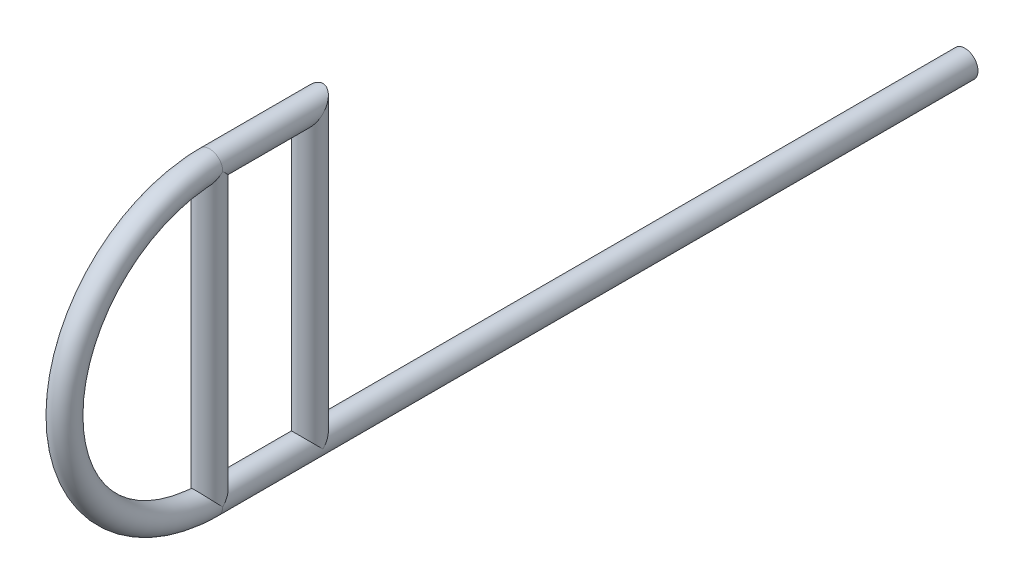
ISO-10303-21;
HEADER;
FILE_DESCRIPTION(('STEP AP214'),'2;1');
FILE_NAME('part.step','',(''),(''),'','','');
FILE_SCHEMA(('AUTOMOTIVE_DESIGN { 1 0 10303 214 1 1 1 1 }'));
ENDSEC;
DATA;
#1=APPLICATION_CONTEXT('core data for automotive mechanical design processes');
#2=APPLICATION_PROTOCOL_DEFINITION('international standard','automotive_design',2000,#1);
#3=PRODUCT_CONTEXT('',#1,'mechanical');
#4=PRODUCT('Part','Part','',(#3));
#5=PRODUCT_RELATED_PRODUCT_CATEGORY('part','',(#4));
#6=PRODUCT_DEFINITION_FORMATION('','',#4);
#7=PRODUCT_DEFINITION_CONTEXT('part definition',#1,'design');
#8=PRODUCT_DEFINITION('design','',#6,#7);
#9=PRODUCT_DEFINITION_SHAPE('','',#8);
#10=(LENGTH_UNIT() NAMED_UNIT(*) SI_UNIT(.MILLI.,.METRE.));
#11=(NAMED_UNIT(*) PLANE_ANGLE_UNIT() SI_UNIT($,.RADIAN.));
#12=(NAMED_UNIT(*) SI_UNIT($,.STERADIAN.) SOLID_ANGLE_UNIT());
#13=UNCERTAINTY_MEASURE_WITH_UNIT(LENGTH_MEASURE(1.E-05),#10,'distance_accuracy_value','');
#14=(GEOMETRIC_REPRESENTATION_CONTEXT(3) GLOBAL_UNCERTAINTY_ASSIGNED_CONTEXT((#13)) GLOBAL_UNIT_ASSIGNED_CONTEXT((#10,
#11,#12)) REPRESENTATION_CONTEXT('',''));
#15=CARTESIAN_POINT('',(0.,0.,0.));
#16=DIRECTION('',(0.,0.,1.));
#17=DIRECTION('',(1.,0.,0.));
#18=AXIS2_PLACEMENT_3D('',#15,#16,#17);
#19=CARTESIAN_POINT('',(0.,500.,2600.));
#20=DIRECTION('',(1.,0.,0.));
#21=DIRECTION('',(0.,0.,-1.));
#22=AXIS2_PLACEMENT_3D('',#19,#20,#21);
#23=TOROIDAL_SURFACE('',#22,500.,45.);
#24=CARTESIAN_POINT('',(0.,0.,2600.));
#25=DIRECTION('',(0.,0.,-1.));
#26=DIRECTION('',(1.,0.,0.));
#27=AXIS2_PLACEMENT_3D('',#24,#25,#26);
#28=CIRCLE('',#27,45.);
#29=CARTESIAN_POINT('',(45.,0.,2600.));
#30=VERTEX_POINT('',#29);
#31=CARTESIAN_POINT('',(-45.,0.,2600.));
#32=VERTEX_POINT('',#31);
#33=EDGE_CURVE('E96',#30,#32,#28,.T.);
#34=ORIENTED_EDGE('',*,*,#33,.F.);
#35=CARTESIAN_POINT('',(45.,0.,2600.));
#36=CARTESIAN_POINT('',(44.9999999986932,0.00999996302583945,2600.00999996408));
#37=CARTESIAN_POINT('',(44.9999966653993,0.020000113522494,2600.01999981456));
#38=CARTESIAN_POINT('',(44.99881184836,1.79770313038391,2601.79759597686));
#39=CARTESIAN_POINT('',(44.893529322003,3.57121797631516,2603.56159714986));
#40=CARTESIAN_POINT('',(44.580833591385,6.22910752234717,2606.19109415175));
#41=CARTESIAN_POINT('',(44.4506943152232,7.11515092709802,2607.06530950447));
#42=CARTESIAN_POINT('',(44.1386637373208,8.88501733441618,2608.80685606489));
#43=CARTESIAN_POINT('',(43.9567751953007,9.76884045285351,2609.67418763716));
#44=CARTESIAN_POINT('',(43.5405102554132,11.5347274361979,2611.40245925246));
#45=CARTESIAN_POINT('',(43.3060049168106,12.4167815154403,2612.26337813296));
#46=CARTESIAN_POINT('',(42.7843193220845,14.1752325468286,2613.97506832337));
#47=CARTESIAN_POINT('',(42.4971372671155,15.0516293047256,2614.82583928567));
#48=CARTESIAN_POINT('',(41.8696152121863,16.7964043792479,2616.51504577532));
#49=CARTESIAN_POINT('',(41.5293014252306,17.6647864274336,2617.35348716356));
#50=CARTESIAN_POINT('',(40.7946104758397,19.3917610906813,2619.01646649757));
#51=CARTESIAN_POINT('',(40.4002375732208,20.2503544713143,2619.84100553309));
#52=CARTESIAN_POINT('',(39.3751024330716,22.3217165897374,2621.82494152252));
#53=CARTESIAN_POINT('',(38.7155444619308,23.5282808170849,2622.97611753024));
#54=CARTESIAN_POINT('',(37.2798609092361,25.9088605230274,2625.23900833794));
#55=CARTESIAN_POINT('',(36.5037335543683,27.0828755061445,2626.35072253727));
#56=CARTESIAN_POINT('',(34.831888360656,29.3861676793877,2628.52394423225));
#57=CARTESIAN_POINT('',(33.9364181370007,30.5155313857091,2629.58554967954));
#58=CARTESIAN_POINT('',(32.0195226444961,32.7195288931591,2631.65017417586));
#59=CARTESIAN_POINT('',(30.9981421457346,33.7941819568765,2632.65321386332));
#60=CARTESIAN_POINT('',(29.1442688036855,35.5670234134798,2634.30254940317));
#61=CARTESIAN_POINT('',(28.3446974469558,36.2828978987516,2634.96693266599));
#62=CARTESIAN_POINT('',(26.6784966984185,37.6729575890962,2636.25418854141));
#63=CARTESIAN_POINT('',(25.8118702723482,38.3471446355668,2636.87706298762));
#64=CARTESIAN_POINT('',(24.0111669276449,39.6453541176671,2638.07402083513));
#65=CARTESIAN_POINT('',(23.0771551252901,40.2694237824434,2638.64815020226));
#66=CARTESIAN_POINT('',(21.6255215234122,41.1611705258364,2639.4670171817));
#67=CARTESIAN_POINT('',(21.1332397268497,41.451009904865,2639.73290317372));
#68=CARTESIAN_POINT('',(20.1317232302389,42.0147744659537,2640.24961261677));
#69=CARTESIAN_POINT('',(19.6224842991897,42.2886956287182,2640.50043226412));
#70=CARTESIAN_POINT('',(18.2991680338212,42.9669332518282,2641.12094637064));
#71=CARTESIAN_POINT('',(17.4732327858035,43.3589319459702,2641.47907046151));
#72=CARTESIAN_POINT('',(15.7832518593273,44.0953709520147,2642.15110488879));
#73=CARTESIAN_POINT('',(14.9192155421078,44.4398228609618,2642.46502600706));
#74=CARTESIAN_POINT('',(13.156224965383,45.0755658754275,2643.04386031915));
#75=CARTESIAN_POINT('',(12.2572872613276,45.3668818211528,2643.30879641349));
#76=CARTESIAN_POINT('',(10.4285635902709,45.891050584253,2643.78513087848));
#77=CARTESIAN_POINT('',(9.49877735903547,46.1239029007095,2643.99652879041));
#78=CARTESIAN_POINT('',(7.60646888657219,46.5278211044025,2644.36302423673));
#79=CARTESIAN_POINT('',(6.64373835605481,46.6983557146226,2644.51763772065));
#80=CARTESIAN_POINT('',(4.70063777358671,46.9707618826797,2644.764528081));
#81=CARTESIAN_POINT('',(3.72026775822309,47.0726335829177,2644.85680508672));
#82=CARTESIAN_POINT('',(1.751249908655,47.2050321033683,2644.97672147591));
#83=CARTESIAN_POINT('',(0.76260643303334,47.2355943748919,2645.00439297786));
#84=CARTESIAN_POINT('',(-1.21389864980867,47.2246423044464,2644.99447554492));
#85=CARTESIAN_POINT('',(-2.20176032192966,47.1831347544245,2644.95689275969));
#86=CARTESIAN_POINT('',(-4.04308012028892,47.038932304486,2644.82627542233));
#87=CARTESIAN_POINT('',(-4.89776004248475,46.9446245610195,2644.74084129009));
#88=CARTESIAN_POINT('',(-6.59346160561982,46.7037710060869,2644.52254328088));
#89=CARTESIAN_POINT('',(-7.43448493893702,46.5572317198166,2644.38968532848));
#90=CARTESIAN_POINT('',(-9.09805038886525,46.2145707203128,2644.07881344811));
#91=CARTESIAN_POINT('',(-9.92058748642625,46.0184357146662,2643.90078741437));
#92=CARTESIAN_POINT('',(-11.5427853506081,45.5799178191097,2643.50243693436));
#93=CARTESIAN_POINT('',(-12.3424425952603,45.3375278526021,2643.28210601579));
#94=CARTESIAN_POINT('',(-14.1431825159683,44.7338228300023,2642.73282345457));
#95=CARTESIAN_POINT('',(-15.1356019911335,44.3583901581348,2642.39088894665));
#96=CARTESIAN_POINT('',(-17.0717858049286,43.5448795753348,2641.6488883719));
#97=CARTESIAN_POINT('',(-18.015538301653,43.106786514492,2641.24880824634));
#98=CARTESIAN_POINT('',(-19.8526070321791,42.1753306121579,2640.39678912948));
#99=CARTESIAN_POINT('',(-20.7458534554254,41.6818939532423,2639.94478085631));
#100=CARTESIAN_POINT('',(-22.4791743107989,40.6476474921728,2638.99568389182));
#101=CARTESIAN_POINT('',(-23.319245504604,40.1068348096351,2638.49859245944));
#102=CARTESIAN_POINT('',(-25.2669047106227,38.7630598642635,2637.26109621901));
#103=CARTESIAN_POINT('',(-26.3493868604959,37.9408051051947,2636.50202937921));
#104=CARTESIAN_POINT('',(-28.4124896348026,36.2322603308394,2634.92021423904));
#105=CARTESIAN_POINT('',(-29.3930713330206,35.3459460622784,2634.0974418109));
#106=CARTESIAN_POINT('',(-31.256758783689,33.5204420369732,2632.39765658471));
#107=CARTESIAN_POINT('',(-32.1397028874833,32.5811683698045,2631.5205574802));
#108=CARTESIAN_POINT('',(-33.8098789778083,30.6612025899375,2629.72201473726));
#109=CARTESIAN_POINT('',(-34.5971118541541,29.6805108624118,2628.80057151121));
#110=CARTESIAN_POINT('',(-35.8605775114576,27.980398463123,2627.19799057968));
#111=CARTESIAN_POINT('',(-36.360033026481,27.2692751337286,2626.52617773136));
#112=CARTESIAN_POINT('',(-37.314343927897,25.8328692677035,2625.16604780005));
#113=CARTESIAN_POINT('',(-37.7691956629612,25.1075855777035,2624.47772937161));
#114=CARTESIAN_POINT('',(-38.6354308592419,23.6448009836515,2623.08625959301));
#115=CARTESIAN_POINT('',(-39.0467972731029,22.90729541841,2622.38310255435));
#116=CARTESIAN_POINT('',(-39.8267686471452,21.4222374458225,2620.9638765679));
#117=CARTESIAN_POINT('',(-40.1953745590166,20.6746852624904,2620.24780790787));
#118=CARTESIAN_POINT('',(-40.8905505956047,19.1713476389871,2618.80437182466));
#119=CARTESIAN_POINT('',(-41.2171300650811,18.4155640697792,2618.07700695368));
#120=CARTESIAN_POINT('',(-41.8289826000133,16.8971675464938,2616.61223015549));
#121=CARTESIAN_POINT('',(-42.1142555484229,16.1345545730709,2615.87481819981));
#122=CARTESIAN_POINT('',(-42.9087591422696,13.8390438481191,2613.64986267299));
#123=CARTESIAN_POINT('',(-43.3570681349889,12.2976171346521,2612.1487766362));
#124=CARTESIAN_POINT('',(-43.937180517606,9.8600222253728,2609.76359668167));
#125=CARTESIAN_POINT('',(-44.122555897113,8.96769946724692,2608.88807795815));
#126=CARTESIAN_POINT('',(-44.440555482807,7.18065330266681,2607.1298901632));
#127=CARTESIAN_POINT('',(-44.5731757114743,6.28592972031847,2606.24722055774));
#128=CARTESIAN_POINT('',(-44.8916188132836,3.60331542917498,2603.59352167261));
#129=CARTESIAN_POINT('',(-44.9988012063718,1.81370087977576,2601.81359276295));
#130=CARTESIAN_POINT('',(-44.9999966652853,0.0200001136528883,2600.01999981466));
#131=CARTESIAN_POINT('',(-44.9999999985784,0.00999996315337867,2600.0099999642));
#132=CARTESIAN_POINT('',(-45.,0.,2600.));
#133=B_SPLINE_CURVE_WITH_KNOTS('',3,(#35,#36,#37,#38,#39,#40,#41,#42,#43,#44,#45,#46,#47,#48,
#49,#50,#51,#52,#53,#54,#55,#56,#57,#58,#59,#60,#61,#62,#63,#64,#65,#66,#67,#68,#69,#70,#71,#72,
#73,#74,#75,#76,#77,#78,#79,#80,#81,#82,#83,#84,#85,#86,#87,#88,#89,#90,#91,#92,#93,#94,#95,#96,
#97,#98,#99,#100,#101,#102,#103,#104,#105,#106,#107,#108,#109,#110,#111,#112,#113,#114,#115,
#116,#117,#118,#119,#120,#121,#122,#123,#124,#125,#126,#127,#128,#129,#130,#131,#132),
.UNSPECIFIED.,.F.,.F.,(4,2,2,2,2,2,2,2,2,2,2,2,2,2,2,2,2,2,2,2,2,2,2,2,2,2,2,2,2,2,2,2,2,2,2,2,
2,2,2,2,2,2,2,2,2,2,2,2,4),(0.,0.042426408054733,7.54190156531354,11.2956913933576,
15.0492810742344,18.8121716200652,22.5751906879392,26.3363590701297,30.0972312453661,
35.4727884833384,40.8484275053595,46.2130818026624,51.5758340549752,55.3597195629169,
59.1434378112828,62.9235474996956,64.8133682863379,66.7036641913574,69.6464673285906,
72.5885514192815,75.5292565881605,78.4699869522412,81.4352332460077,84.4004733900917,
87.3642390577824,90.327725431769,92.9170442735466,95.5060397495268,98.0957298528062,
100.685816473742,104.025301128545,107.365594566784,110.710397502761,114.055403938539,
118.719175177101,123.384721488534,128.057879942126,132.730994946644,136.025134603892,
139.319543699354,142.61523953476,145.910862006125,149.205750410845,152.500648151789,
159.08669831908,162.877047634083,166.667682671574,174.235028335622,174.277454743677),.UNSPECIFIED.);
#134=EDGE_CURVE('E90',#30,#32,#133,.T.);
#135=ORIENTED_EDGE('',*,*,#134,.T.);
#136=EDGE_LOOP('',(#34,#135));
#137=FACE_BOUND('',#136,.T.);
#138=CARTESIAN_POINT('',(0.,1000.,2600.));
#139=DIRECTION('',(0.,0.,1.));
#140=DIRECTION('',(1.,0.,0.));
#141=AXIS2_PLACEMENT_3D('',#138,#139,#140);
#142=CIRCLE('',#141,45.);
#143=CARTESIAN_POINT('',(45.,1000.,2600.));
#144=VERTEX_POINT('',#143);
#145=CARTESIAN_POINT('',(-45.,1000.,2600.));
#146=VERTEX_POINT('',#145);
#147=EDGE_CURVE('E89',#144,#146,#142,.T.);
#148=ORIENTED_EDGE('',*,*,#147,.T.);
#149=CARTESIAN_POINT('',(-45.,1000.,2600.));
#150=CARTESIAN_POINT('',(-44.9999999986932,999.990000036967,2600.00999996408));
#151=CARTESIAN_POINT('',(-44.9999966653993,999.979999886464,2600.01999981454));
#152=CARTESIAN_POINT('',(-44.9988118483598,998.202296868682,2601.79759597532));
#153=CARTESIAN_POINT('',(-44.8935293220389,996.428782024065,2603.56159714903));
#154=CARTESIAN_POINT('',(-44.5808335915278,993.770892478829,2606.19109415081));
#155=CARTESIAN_POINT('',(-44.4506943154108,992.884849074149,2607.0653095033));
#156=CARTESIAN_POINT('',(-44.1386637376162,991.114982667076,2608.80685606337));
#157=CARTESIAN_POINT('',(-43.9567751956587,990.231159548812,2609.67418763551));
#158=CARTESIAN_POINT('',(-43.5405102559161,988.465272565788,2611.40245925053));
#159=CARTESIAN_POINT('',(-43.3060049173957,987.583218486693,2612.26337813088));
#160=CARTESIAN_POINT('',(-42.7843193228535,985.824767455603,2613.975068321));
#161=CARTESIAN_POINT('',(-42.4971372679861,984.948370697857,2614.82583928316));
#162=CARTESIAN_POINT('',(-41.8696152132791,983.203595623629,2616.51504577254));
#163=CARTESIAN_POINT('',(-41.5293014264438,982.335213575585,2617.35348716064));
#164=CARTESIAN_POINT('',(-40.7946104773139,980.608238912617,2619.0164664944));
#165=CARTESIAN_POINT('',(-40.4002375748356,979.749645532121,2619.84100552979));
#166=CARTESIAN_POINT('',(-39.3751024348677,977.678283413645,2621.82494151929));
#167=CARTESIAN_POINT('',(-38.715544463744,976.471719186113,2622.9761175272));
#168=CARTESIAN_POINT('',(-37.2798609110568,974.091139479801,2625.23900833525));
#169=CARTESIAN_POINT('',(-36.5037335561795,972.9171244965,2626.35072253477));
#170=CARTESIAN_POINT('',(-34.8318883624178,970.61383232289,2628.5239442301));
#171=CARTESIAN_POINT('',(-33.9364181387223,969.484468616386,2629.58554967757));
#172=CARTESIAN_POINT('',(-32.0195226461067,967.280471108577,2631.65017417424));
#173=CARTESIAN_POINT('',(-30.9981421472742,966.205818044683,2632.65321386186));
#174=CARTESIAN_POINT('',(-29.1442688051655,964.432976587874,2634.30254940191));
#175=CARTESIAN_POINT('',(-28.3446974484628,963.717102102566,2634.96693266477));
#176=CARTESIAN_POINT('',(-26.678496699978,962.327042412145,2636.25418854027));
#177=CARTESIAN_POINT('',(-25.8118702739332,961.652855365635,2636.87706298651));
#178=CARTESIAN_POINT('',(-24.0111669292795,960.354645883453,2638.0740208341));
#179=CARTESIAN_POINT('',(-23.0771551269488,959.730576218634,2638.64815020127));
#180=CARTESIAN_POINT('',(-21.6255215251048,958.838829475174,2639.46701718077));
#181=CARTESIAN_POINT('',(-21.1332397285532,958.548990096123,2639.73290317282));
#182=CARTESIAN_POINT('',(-20.1317232319635,957.985225534988,2640.2496126159));
#183=CARTESIAN_POINT('',(-19.6224843009245,957.7113043722,2640.50043226328));
#184=CARTESIAN_POINT('',(-18.2991680355652,957.03306674902,2641.12094636987));
#185=CARTESIAN_POINT('',(-17.4732327875453,956.641068054833,2641.47907046077));
#186=CARTESIAN_POINT('',(-15.7832518610602,955.904629048697,2642.15110488814));
#187=CARTESIAN_POINT('',(-14.9192155438342,955.560177139703,2642.46502600645));
#188=CARTESIAN_POINT('',(-13.156224967091,954.924434125146,2643.04386031863));
#189=CARTESIAN_POINT('',(-12.2572872630238,954.633118179375,2643.30879641301));
#190=CARTESIAN_POINT('',(-10.4285635919381,954.108949416184,2643.78513087808));
#191=CARTESIAN_POINT('',(-9.49877736068554,953.876097099682,2643.99652879005));
#192=CARTESIAN_POINT('',(-7.60646888818053,953.472178895901,2644.36302423645));
#193=CARTESIAN_POINT('',(-6.64373835763848,953.301644285637,2644.51763772041));
#194=CARTESIAN_POINT('',(-4.70063777511533,953.029238117497,2644.76452808084));
#195=CARTESIAN_POINT('',(-3.72026775972131,952.927366417219,2644.8568050866));
#196=CARTESIAN_POINT('',(-1.75124991008743,952.794967896692,2644.97672147586));
#197=CARTESIAN_POINT('',(-0.76260643443038,952.764405625133,2645.00439297783));
#198=CARTESIAN_POINT('',(1.21389864848672,952.775357695513,2644.99447554496));
#199=CARTESIAN_POINT('',(2.20176032064741,952.816865245505,2644.95689275975));
#200=CARTESIAN_POINT('',(4.04308011905928,952.961067695391,2644.82627542244));
#201=CARTESIAN_POINT('',(4.89776004126789,953.055375438833,2644.74084129023));
#202=CARTESIAN_POINT('',(6.59346160443089,953.296228993719,2644.52254328106));
#203=CARTESIAN_POINT('',(7.43448493776323,953.442768279966,2644.38968532868));
#204=CARTESIAN_POINT('',(9.09805038772356,953.785429279427,2644.07881344835));
#205=CARTESIAN_POINT('',(9.9205874853015,953.981564285054,2643.90078741462));
#206=CARTESIAN_POINT('',(11.5427853495185,954.420082180572,2643.50243693465));
#207=CARTESIAN_POINT('',(12.342442594189,954.662472147062,2643.2821060161));
#208=CARTESIAN_POINT('',(14.1431825149022,955.266177169611,2642.73282345492));
#209=CARTESIAN_POINT('',(15.1356019900562,955.641609841444,2642.39088894704));
#210=CARTESIAN_POINT('',(17.071785803833,956.455120424174,2641.64888837235));
#211=CARTESIAN_POINT('',(18.0155383005503,956.893213484982,2641.24880824682));
#212=CARTESIAN_POINT('',(19.8526070310662,957.824669387245,2640.39678913003));
#213=CARTESIAN_POINT('',(20.7458534543094,958.318106046126,2639.94478085689));
#214=CARTESIAN_POINT('',(22.4791743096796,959.352352507125,2638.99568389246));
#215=CARTESIAN_POINT('',(23.3192455034846,959.893165189628,2638.49859246012));
#216=CARTESIAN_POINT('',(25.2669047094979,961.236940134911,2637.26109621978));
#217=CARTESIAN_POINT('',(26.349386859368,962.059194893925,2636.50202938003));
#218=CARTESIAN_POINT('',(28.4124896336752,963.767739668173,2634.92021423996));
#219=CARTESIAN_POINT('',(29.3930713318966,964.65405393668,2634.09744181187));
#220=CARTESIAN_POINT('',(31.2567587825766,966.479557961878,2632.39765658578));
#221=CARTESIAN_POINT('',(32.1397028863791,967.418831628992,2631.52055748132));
#222=CARTESIAN_POINT('',(33.8098789767262,969.338797408752,2629.72201473849));
#223=CARTESIAN_POINT('',(34.5971118530857,970.319489136225,2628.80057151249));
#224=CARTESIAN_POINT('',(35.8605775104208,972.019601535429,2627.19799058105));
#225=CARTESIAN_POINT('',(36.3600330254605,972.730724864792,2626.52617773276));
#226=CARTESIAN_POINT('',(37.3143439269109,974.167130730755,2625.16604780151));
#227=CARTESIAN_POINT('',(37.7691956619932,974.892414420724,2624.47772937311));
#228=CARTESIAN_POINT('',(38.6354308583122,976.355199014716,2623.08625959456));
#229=CARTESIAN_POINT('',(39.0467972721933,977.092704579928,2622.38310255594));
#230=CARTESIAN_POINT('',(39.8267686462777,978.577762552456,2620.96387656955));
#231=CARTESIAN_POINT('',(40.1953745581711,979.325314735759,2620.24780790955));
#232=CARTESIAN_POINT('',(40.8905505948061,980.828652359207,2618.80437182639));
#233=CARTESIAN_POINT('',(41.2171300643072,981.584435928389,2618.07700695545));
#234=CARTESIAN_POINT('',(41.8289825992909,983.102832451625,2616.61223015731));
#235=CARTESIAN_POINT('',(42.114255547727,983.865445425024,2615.87481820166));
#236=CARTESIAN_POINT('',(42.9087591416556,986.160956149896,2613.64986267492));
#237=CARTESIAN_POINT('',(43.3570681344329,987.702382863301,2612.14877663816));
#238=CARTESIAN_POINT('',(43.9371805171946,990.139977772732,2609.76359668355));
#239=CARTESIAN_POINT('',(44.1225558967737,991.032300531051,2608.88807795988));
#240=CARTESIAN_POINT('',(44.4405554825914,992.819346695917,2607.12989016453));
#241=CARTESIAN_POINT('',(44.5731757113102,993.714070278358,2606.24722055882));
#242=CARTESIAN_POINT('',(44.8916188132424,996.396684570359,2603.59352167352));
#243=CARTESIAN_POINT('',(44.9988012063719,998.186299121106,2601.81359276452));
#244=CARTESIAN_POINT('',(44.9999966652853,999.979999886361,2600.01999981468));
#245=CARTESIAN_POINT('',(44.9999999985784,999.990000036854,2600.0099999642));
#246=CARTESIAN_POINT('',(45.,1000.,2600.));
#247=B_SPLINE_CURVE_WITH_KNOTS('',3,(#149,#150,#151,#152,#153,#154,#155,#156,#157,#158,#159,
#160,#161,#162,#163,#164,#165,#166,#167,#168,#169,#170,#171,#172,#173,#174,#175,#176,#177,#178,
#179,#180,#181,#182,#183,#184,#185,#186,#187,#188,#189,#190,#191,#192,#193,#194,#195,#196,#197,
#198,#199,#200,#201,#202,#203,#204,#205,#206,#207,#208,#209,#210,#211,#212,#213,#214,#215,#216,
#217,#218,#219,#220,#221,#222,#223,#224,#225,#226,#227,#228,#229,#230,#231,#232,#233,#234,#235,
#236,#237,#238,#239,#240,#241,#242,#243,#244,#245,#246),.UNSPECIFIED.,.F.,.F.,(4,2,2,2,2,2,2,2,
2,2,2,2,2,2,2,2,2,2,2,2,2,2,2,2,2,2,2,2,2,2,2,2,2,2,2,2,2,2,2,2,2,2,2,2,2,2,2,2,4),(0.,
0.0424264080546858,7.54190156403154,11.2956913914214,15.0492810716474,18.8121716168109,
22.5751906840154,26.3363590655453,30.0972312401221,35.4727884788041,40.8484275015322,
46.2130817995548,51.5758340525864,55.3597195605959,59.1434378090291,62.923547497507,
64.813368284182,66.703664189234,69.6464673265741,72.5885514173716,75.5292565863576,
78.4699869505454,81.4352332444244,84.4004733886208,87.3642390564231,90.3277254305211,
92.9170442723218,95.5060397483252,98.0957298516275,100.685816472587,104.025301127295,
107.36559456544,110.710397501323,114.055403937007,118.719175175401,123.384721486666,
128.057879940086,132.730994944433,136.025134601583,139.319543696948,142.615239532257,
145.910862003525,149.205750408159,152.500648149017,159.086698316134,162.877047631878,
166.667682670112,174.235028335621,174.277454743676),.UNSPECIFIED.);
#248=EDGE_CURVE('E83',#146,#144,#247,.T.);
#249=ORIENTED_EDGE('',*,*,#248,.T.);
#250=EDGE_LOOP('',(#148,#249));
#251=FACE_BOUND('',#250,.T.);
#252=ADVANCED_FACE('F51',(#137,#251),#23,.T.);
#253=CARTESIAN_POINT('',(0.,0.,2600.));
#254=DIRECTION('',(0.,0.,-1.));
#255=DIRECTION('',(-1.,0.,0.));
#256=AXIS2_PLACEMENT_3D('',#253,#254,#255);
#257=CYLINDRICAL_SURFACE('',#256,45.);
#258=CARTESIAN_POINT('',(0.,0.,0.));
#259=DIRECTION('',(0.,0.,-1.));
#260=DIRECTION('',(1.,0.,0.));
#261=AXIS2_PLACEMENT_3D('',#258,#259,#260);
#262=CIRCLE('',#261,45.);
#263=CARTESIAN_POINT('',(45.,0.,0.));
#264=VERTEX_POINT('',#263);
#265=EDGE_CURVE('E99',#264,#264,#262,.T.);
#266=ORIENTED_EDGE('',*,*,#265,.F.);
#267=EDGE_LOOP('',(#266));
#268=FACE_BOUND('',#267,.T.);
#269=CARTESIAN_POINT('',(0.,0.,2255.));
#270=DIRECTION('',(0.,0.707106781186547,-0.707106781186547));
#271=DIRECTION('',(0.,-0.707106781186547,-0.707106781186547));
#272=AXIS2_PLACEMENT_3D('',#269,#270,#271);
#273=ELLIPSE('',#272,63.6396103067892,44.9999999999999);
#274=CARTESIAN_POINT('',(45.,0.,2255.));
#275=VERTEX_POINT('',#274);
#276=CARTESIAN_POINT('',(-45.,0.,2255.));
#277=VERTEX_POINT('',#276);
#278=EDGE_CURVE('E94',#275,#277,#273,.F.);
#279=ORIENTED_EDGE('',*,*,#278,.T.);
#280=CARTESIAN_POINT('',(0.,0.,2255.));
#281=DIRECTION('',(0.,-0.707106781186547,-0.707106781186547));
#282=DIRECTION('',(0.,0.707106781186547,-0.707106781186547));
#283=AXIS2_PLACEMENT_3D('',#280,#281,#282);
#284=ELLIPSE('',#283,63.6396103067892,44.9999999999999);
#285=EDGE_CURVE('E72',#277,#275,#284,.T.);
#286=ORIENTED_EDGE('',*,*,#285,.T.);
#287=EDGE_LOOP('',(#279,#286));
#288=FACE_BOUND('',#287,.T.);
#289=ORIENTED_EDGE('',*,*,#33,.T.);
#290=CARTESIAN_POINT('',(0.,0.,2600.));
#291=DIRECTION('',(0.,-0.707106781186547,-0.707106781186547));
#292=DIRECTION('',(0.,0.707106781186547,-0.707106781186547));
#293=AXIS2_PLACEMENT_3D('',#290,#291,#292);
#294=ELLIPSE('',#293,63.6396103067892,45.);
#295=EDGE_CURVE('E12',#32,#30,#294,.T.);
#296=ORIENTED_EDGE('',*,*,#295,.T.);
#297=EDGE_LOOP('',(#289,#296));
#298=FACE_BOUND('',#297,.T.);
#299=ADVANCED_FACE('F117',(#268,#288,#298),#257,.T.);
#300=CARTESIAN_POINT('',(0.,0.,0.));
#301=DIRECTION('',(0.,0.,-1.));
#302=DIRECTION('',(1.,0.,0.));
#303=AXIS2_PLACEMENT_3D('',#300,#301,#302);
#304=PLANE('',#303);
#305=ORIENTED_EDGE('',*,*,#265,.T.);
#306=EDGE_LOOP('',(#305));
#307=FACE_BOUND('',#306,.T.);
#308=ADVANCED_FACE('F53',(#307),#304,.T.);
#309=CARTESIAN_POINT('',(0.,1000.,2210.));
#310=DIRECTION('',(0.,0.,1.));
#311=DIRECTION('',(1.,0.,0.));
#312=AXIS2_PLACEMENT_3D('',#309,#310,#311);
#313=CYLINDRICAL_SURFACE('',#312,45.);
#314=CARTESIAN_POINT('',(0.,1000.,2255.));
#315=DIRECTION('',(0.,0.707106781186543,0.707106781186551));
#316=DIRECTION('',(0.,-0.707106781186552,0.707106781186544));
#317=AXIS2_PLACEMENT_3D('',#314,#315,#316);
#318=ELLIPSE('',#317,63.6396103067889,45.);
#319=CARTESIAN_POINT('',(0.,955.,2300.));
#320=VERTEX_POINT('',#319);
#321=EDGE_CURVE('E59',#320,#320,#318,.F.);
#322=ORIENTED_EDGE('',*,*,#321,.F.);
#323=EDGE_LOOP('',(#322));
#324=FACE_BOUND('',#323,.T.);
#325=ORIENTED_EDGE('',*,*,#147,.F.);
#326=CARTESIAN_POINT('',(0.,1000.,2600.));
#327=DIRECTION('',(0.,-0.707106781186547,0.707106781186547));
#328=DIRECTION('',(0.,-0.707106781186547,-0.707106781186547));
#329=AXIS2_PLACEMENT_3D('',#326,#327,#328);
#330=ELLIPSE('',#329,63.6396103067892,45.);
#331=EDGE_CURVE('E65',#146,#144,#330,.T.);
#332=ORIENTED_EDGE('',*,*,#331,.F.);
#333=EDGE_LOOP('',(#325,#332));
#334=FACE_BOUND('',#333,.T.);
#335=ADVANCED_FACE('F93',(#324,#334),#313,.T.);
#336=CARTESIAN_POINT('',(0.,1045.001,2255.));
#337=DIRECTION('',(0.,-1.,0.));
#338=DIRECTION('',(0.,0.,-1.));
#339=AXIS2_PLACEMENT_3D('',#336,#337,#338);
#340=CYLINDRICAL_SURFACE('',#339,44.9999999999999);
#341=ORIENTED_EDGE('',*,*,#285,.F.);
#342=ORIENTED_EDGE('',*,*,#278,.F.);
#343=EDGE_LOOP('',(#341,#342));
#344=FACE_BOUND('',#343,.T.);
#345=ORIENTED_EDGE('',*,*,#321,.T.);
#346=EDGE_LOOP('',(#345));
#347=FACE_BOUND('',#346,.T.);
#348=ADVANCED_FACE('F113',(#344,#347),#340,.T.);
#349=CARTESIAN_POINT('',(0.,1045.001,2600.));
#350=DIRECTION('',(0.,-1.,0.));
#351=DIRECTION('',(0.,0.,-1.));
#352=AXIS2_PLACEMENT_3D('',#349,#350,#351);
#353=CYLINDRICAL_SURFACE('',#352,45.);
#354=ORIENTED_EDGE('',*,*,#248,.F.);
#355=ORIENTED_EDGE('',*,*,#331,.T.);
#356=EDGE_LOOP('',(#354,#355));
#357=FACE_BOUND('',#356,.T.);
#358=ORIENTED_EDGE('',*,*,#134,.F.);
#359=ORIENTED_EDGE('',*,*,#295,.F.);
#360=EDGE_LOOP('',(#358,#359));
#361=FACE_BOUND('',#360,.T.);
#362=ADVANCED_FACE('F84',(#357,#361),#353,.T.);
#363=CLOSED_SHELL('',(#252,#299,#308,#335,#348,#362));
#364=MANIFOLD_SOLID_BREP('B2',#363);
#365=ADVANCED_BREP_SHAPE_REPRESENTATION('',(#18,#364),#14);
#366=SHAPE_DEFINITION_REPRESENTATION(#9,#365);
ENDSEC;
END-ISO-10303-21;
